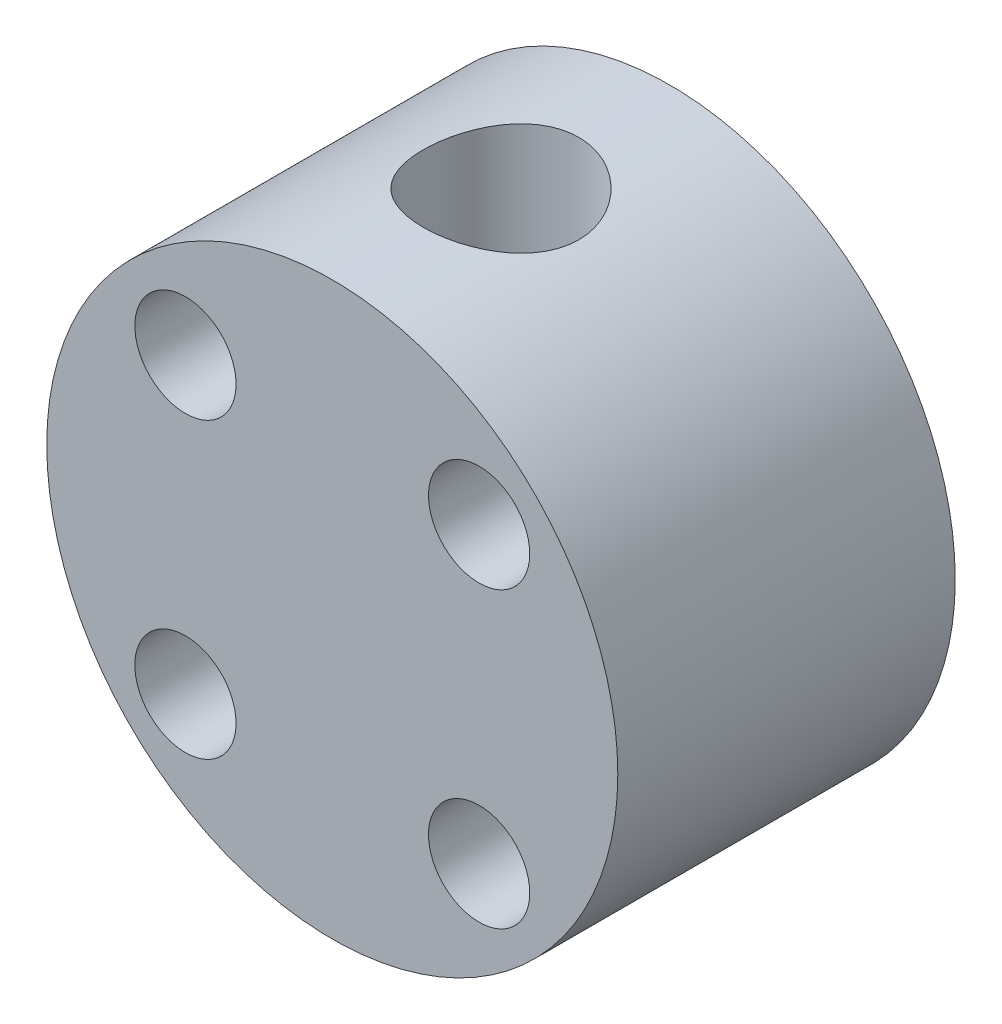
ISO-10303-21;
HEADER;
FILE_DESCRIPTION(('STEP AP214'),'2;1');
FILE_NAME('part.step','',(''),(''),'','','');
FILE_SCHEMA(('AUTOMOTIVE_DESIGN { 1 0 10303 214 1 1 1 1 }'));
ENDSEC;
DATA;
#1=APPLICATION_CONTEXT('core data for automotive mechanical design processes');
#2=APPLICATION_PROTOCOL_DEFINITION('international standard','automotive_design',2000,#1);
#3=PRODUCT_CONTEXT('',#1,'mechanical');
#4=PRODUCT('Part','Part','',(#3));
#5=PRODUCT_RELATED_PRODUCT_CATEGORY('part','',(#4));
#6=PRODUCT_DEFINITION_FORMATION('','',#4);
#7=PRODUCT_DEFINITION_CONTEXT('part definition',#1,'design');
#8=PRODUCT_DEFINITION('design','',#6,#7);
#9=PRODUCT_DEFINITION_SHAPE('','',#8);
#10=(LENGTH_UNIT() NAMED_UNIT(*) SI_UNIT(.MILLI.,.METRE.));
#11=(NAMED_UNIT(*) PLANE_ANGLE_UNIT() SI_UNIT($,.RADIAN.));
#12=(NAMED_UNIT(*) SI_UNIT($,.STERADIAN.) SOLID_ANGLE_UNIT());
#13=UNCERTAINTY_MEASURE_WITH_UNIT(LENGTH_MEASURE(1.E-05),#10,'distance_accuracy_value','');
#14=(GEOMETRIC_REPRESENTATION_CONTEXT(3) GLOBAL_UNCERTAINTY_ASSIGNED_CONTEXT((#13)) GLOBAL_UNIT_ASSIGNED_CONTEXT((#10,
#11,#12)) REPRESENTATION_CONTEXT('',''));
#15=CARTESIAN_POINT('',(0.,0.,0.));
#16=DIRECTION('',(0.,0.,1.));
#17=DIRECTION('',(1.,0.,0.));
#18=AXIS2_PLACEMENT_3D('',#15,#16,#17);
#19=CARTESIAN_POINT('',(0.,0.,6.5));
#20=DIRECTION('',(0.,0.,-1.));
#21=DIRECTION('',(-1.,0.,0.));
#22=AXIS2_PLACEMENT_3D('',#19,#20,#21);
#23=CYLINDRICAL_SURFACE('',#22,11.);
#24=CARTESIAN_POINT('',(0.,-11.,3.));
#25=CARTESIAN_POINT('',(0.165241826664387,-10.9999976543482,2.99999637477795));
#26=CARTESIAN_POINT('',(0.330521957625416,-10.9962401452152,2.98630187283317));
#27=CARTESIAN_POINT('',(0.656311860315395,-10.981615961709,2.93198833939364));
#28=CARTESIAN_POINT('',(0.81681945595453,-10.97074609481,2.89135721674281));
#29=CARTESIAN_POINT('',(1.12831525211079,-10.9430954434827,2.78459653652315));
#30=CARTESIAN_POINT('',(1.27931573394033,-10.9263224773879,2.71850069467617));
#31=CARTESIAN_POINT('',(1.56808899231944,-10.888633088257,2.56281413467515));
#32=CARTESIAN_POINT('',(1.70586072657955,-10.8677163391303,2.47322156729215));
#33=CARTESIAN_POINT('',(1.96759389514652,-10.8234279408412,2.27080032706548));
#34=CARTESIAN_POINT('',(2.09119025833987,-10.8000128298086,2.15750911829159));
#35=CARTESIAN_POINT('',(2.31788587364956,-10.7536422587013,1.91189472794019));
#36=CARTESIAN_POINT('',(2.42098235649443,-10.7306868611041,1.77956897919537));
#37=CARTESIAN_POINT('',(2.60555589078995,-10.6873876832732,1.49669750484106));
#38=CARTESIAN_POINT('',(2.68660853675173,-10.6670986011725,1.34586571012744));
#39=CARTESIAN_POINT('',(2.82205832722455,-10.6320701482383,1.03207234360125));
#40=CARTESIAN_POINT('',(2.87646063893688,-10.6173297017151,0.86911313022302));
#41=CARTESIAN_POINT('',(2.95578912882536,-10.5955169438548,0.539744209975064));
#42=CARTESIAN_POINT('',(2.98137921086458,-10.5882722456757,0.373506103676164));
#43=CARTESIAN_POINT('',(3.00442728818267,-10.5817565816817,0.0389506339823835));
#44=CARTESIAN_POINT('',(3.00189080281765,-10.5824840514652,-0.129366315000041));
#45=CARTESIAN_POINT('',(2.96928383560602,-10.5916764975091,-0.458083101932537));
#46=CARTESIAN_POINT('',(2.94002147337864,-10.5999143662734,-0.618570469204468));
#47=CARTESIAN_POINT('',(2.85608967743614,-10.6228351158812,-0.932266572045616));
#48=CARTESIAN_POINT('',(2.80141813009295,-10.6375185328831,-1.08547470093259));
#49=CARTESIAN_POINT('',(2.66757259652941,-10.6718723658465,-1.38234704109491));
#50=CARTESIAN_POINT('',(2.58811903765895,-10.6915991952828,-1.52587840206724));
#51=CARTESIAN_POINT('',(2.40715976044348,-10.7337873759558,-1.79785289481933));
#52=CARTESIAN_POINT('',(2.30564952212418,-10.756249287265,-1.92629292567749));
#53=CARTESIAN_POINT('',(2.07934693365792,-10.8023178998121,-2.16905037961287));
#54=CARTESIAN_POINT('',(1.9538772923345,-10.8259374859423,-2.28273489857788));
#55=CARTESIAN_POINT('',(1.68536402357727,-10.8709729541596,-2.48758192995557));
#56=CARTESIAN_POINT('',(1.54231963943711,-10.8923887412858,-2.57874347209924));
#57=CARTESIAN_POINT('',(1.24170790747925,-10.9307455624252,-2.73625334554985));
#58=CARTESIAN_POINT('',(1.08407527483555,-10.9476650257461,-2.80248267716789));
#59=CARTESIAN_POINT('',(0.75934537742878,-10.9749671228522,-2.90731594502829));
#60=CARTESIAN_POINT('',(0.592250288635364,-10.9853512528913,-2.94592620488828));
#61=CARTESIAN_POINT('',(0.258736340966502,-10.9981845755262,-2.99342123559394));
#62=CARTESIAN_POINT('',(0.0924485955679613,-11.0008632625074,-3.00316599064073));
#63=CARTESIAN_POINT('',(-0.239386731275946,-10.9986460317028,-2.99503450497314));
#64=CARTESIAN_POINT('',(-0.404934391065018,-10.9937509356601,-2.97716126076701));
#65=CARTESIAN_POINT('',(-0.727490195479109,-10.977084785319,-2.91500499459373));
#66=CARTESIAN_POINT('',(-0.88459864854534,-10.965439729442,-2.87120561448602));
#67=CARTESIAN_POINT('',(-1.18921973489728,-10.9365984707135,-2.75900551071898));
#68=CARTESIAN_POINT('',(-1.33673130261004,-10.9194016526918,-2.69060206067729));
#69=CARTESIAN_POINT('',(-1.62128232238913,-10.8808314765631,-2.52956711542878));
#70=CARTESIAN_POINT('',(-1.75804920482497,-10.8593805909887,-2.43647302547745));
#71=CARTESIAN_POINT('',(-2.01432044026183,-10.8147797682096,-2.22927742490896));
#72=CARTESIAN_POINT('',(-2.133821212356,-10.7916294800542,-2.11517156768291));
#73=CARTESIAN_POINT('',(-2.35582120688549,-10.7453880311357,-1.86517192393236));
#74=CARTESIAN_POINT('',(-2.45771255494154,-10.7223188995483,-1.72873323545015));
#75=CARTESIAN_POINT('',(-2.63717164416209,-10.6796005238857,-1.44020270555345));
#76=CARTESIAN_POINT('',(-2.71474035852927,-10.6599511429925,-1.28811149075488));
#77=CARTESIAN_POINT('',(-2.84277116633766,-10.6265249735947,-0.973318743535631));
#78=CARTESIAN_POINT('',(-2.8933870461064,-10.6127149622546,-0.810683479039428));
#79=CARTESIAN_POINT('',(-2.9664183443807,-10.5925362923412,-0.478766324044368));
#80=CARTESIAN_POINT('',(-2.98884137725659,-10.586165624571,-0.309486240931426));
#81=CARTESIAN_POINT('',(-3.00439791154423,-10.5817601934995,0.0246768076705755));
#82=CARTESIAN_POINT('',(-2.99851066433394,-10.5834467188085,0.18951117749585));
#83=CARTESIAN_POINT('',(-2.95989675286934,-10.5943100332908,0.515741295505627));
#84=CARTESIAN_POINT('',(-2.92717084057027,-10.6034866126106,0.677137139899413));
#85=CARTESIAN_POINT('',(-2.83638816870609,-10.6281263302192,0.990612631537776));
#86=CARTESIAN_POINT('',(-2.77854790898354,-10.6435356626191,1.14275950647964));
#87=CARTESIAN_POINT('',(-2.63934609082672,-10.6789037996565,1.43530655363056));
#88=CARTESIAN_POINT('',(-2.55798069008885,-10.6988633473566,1.5757048021314));
#89=CARTESIAN_POINT('',(-2.37110861969731,-10.7418475876651,1.84542119538421));
#90=CARTESIAN_POINT('',(-2.26493803644257,-10.7649475169129,1.97426740968593));
#91=CARTESIAN_POINT('',(-2.0327202239854,-10.8111998098094,2.2126328135895));
#92=CARTESIAN_POINT('',(-1.90666811877597,-10.834352184944,2.32214724801075));
#93=CARTESIAN_POINT('',(-1.63481545137218,-10.8787291835493,2.52118922903873));
#94=CARTESIAN_POINT('',(-1.48863173252504,-10.8998981550767,2.61020696173393));
#95=CARTESIAN_POINT('',(-1.18279979967855,-10.9373052756075,2.76226487242297));
#96=CARTESIAN_POINT('',(-1.02315990484244,-10.9535464430238,2.82532096110866));
#97=CARTESIAN_POINT('',(-0.720200202436422,-10.9772838799153,2.91587901995799));
#98=CARTESIAN_POINT('',(-0.578129280524935,-10.9857389536219,2.9473491024834));
#99=CARTESIAN_POINT('',(-0.290715215882967,-10.9970977432871,2.98941005063766));
#100=CARTESIAN_POINT('',(-0.145372431129893,-11.0000020636004,3.0000031893096));
#101=CARTESIAN_POINT('',(0.,-11.,3.));
#102=B_SPLINE_CURVE_WITH_KNOTS('',3,(#24,#25,#26,#27,#28,#29,#30,#31,#32,#33,#34,#35,#36,#37,
#38,#39,#40,#41,#42,#43,#44,#45,#46,#47,#48,#49,#50,#51,#52,#53,#54,#55,#56,#57,#58,#59,#60,#61,
#62,#63,#64,#65,#66,#67,#68,#69,#70,#71,#72,#73,#74,#75,#76,#77,#78,#79,#80,#81,#82,#83,#84,#85,
#86,#87,#88,#89,#90,#91,#92,#93,#94,#95,#96,#97,#98,#99,#100,#101),.UNSPECIFIED.,.T.,.F.,(4,2,2,
2,2,2,2,2,2,2,2,2,2,2,2,2,2,2,2,2,2,2,2,2,2,2,2,2,2,2,2,2,2,2,2,2,2,2,4),(0.,0.495192213709794,
0.9906068571026,1.48536780484116,1.98016770272941,2.48571756446357,2.99133567318647,
3.50609187300439,4.02074822781993,4.52328609721851,5.02572535393076,5.51345773349774,
6.00123069167434,6.49471853535856,6.98830760278243,7.4987705710155,8.00925552568848,
8.52214699472057,9.03492099533888,9.53225622686165,10.029537502105,10.5178222240039,
11.0061610695167,11.5043893801936,12.0027208731201,12.5158014612974,13.0288615173582,
13.5389619291417,14.0489245425547,14.5413770446734,15.0338157499215,15.5220911132461,
16.0104462704815,16.5137802279716,17.0172378222293,17.5321174459109,18.0466810522785,
18.4823766419936,18.9180247913559),.UNSPECIFIED.);
#103=CARTESIAN_POINT('',(0.,-11.,3.));
#104=VERTEX_POINT('',#103);
#105=EDGE_CURVE('E10',#104,#104,#102,.T.);
#106=ORIENTED_EDGE('',*,*,#105,.T.);
#107=EDGE_LOOP('',(#106));
#108=FACE_BOUND('',#107,.T.);
#109=CARTESIAN_POINT('',(0.,11.,3.));
#110=CARTESIAN_POINT('',(-0.165241826664387,10.9999976543482,2.99999637477794));
#111=CARTESIAN_POINT('',(-0.330521957625416,10.9962401452152,2.98630187283317));
#112=CARTESIAN_POINT('',(-0.656311860315395,10.981615961709,2.93198833939364));
#113=CARTESIAN_POINT('',(-0.81681945595453,10.97074609481,2.89135721674281));
#114=CARTESIAN_POINT('',(-1.12831525211079,10.9430954434827,2.78459653652315));
#115=CARTESIAN_POINT('',(-1.27931573394033,10.9263224773879,2.71850069467617));
#116=CARTESIAN_POINT('',(-1.56808899231944,10.888633088257,2.56281413467515));
#117=CARTESIAN_POINT('',(-1.70586072657955,10.8677163391303,2.47322156729215));
#118=CARTESIAN_POINT('',(-1.96759389514652,10.8234279408412,2.27080032706548));
#119=CARTESIAN_POINT('',(-2.09119025833987,10.8000128298086,2.15750911829159));
#120=CARTESIAN_POINT('',(-2.31788587364956,10.7536422587013,1.9118947279402));
#121=CARTESIAN_POINT('',(-2.42098235649443,10.7306868611041,1.77956897919537));
#122=CARTESIAN_POINT('',(-2.60555589078995,10.6873876832732,1.49669750484106));
#123=CARTESIAN_POINT('',(-2.68660853675173,10.6670986011725,1.34586571012744));
#124=CARTESIAN_POINT('',(-2.82205832722455,10.6320701482383,1.03207234360125));
#125=CARTESIAN_POINT('',(-2.87646063893688,10.6173297017151,0.869113130223021));
#126=CARTESIAN_POINT('',(-2.95578912882536,10.5955169438548,0.539744209975065));
#127=CARTESIAN_POINT('',(-2.98137921086458,10.5882722456757,0.373506103676164));
#128=CARTESIAN_POINT('',(-3.00442728818267,10.5817565816817,0.0389506339823838));
#129=CARTESIAN_POINT('',(-3.00189080281765,10.5824840514652,-0.129366315000041));
#130=CARTESIAN_POINT('',(-2.96928383560602,10.5916764975091,-0.458083101932537));
#131=CARTESIAN_POINT('',(-2.94002147337864,10.5999143662734,-0.618570469204468));
#132=CARTESIAN_POINT('',(-2.85608967743614,10.6228351158812,-0.932266572045615));
#133=CARTESIAN_POINT('',(-2.80141813009295,10.6375185328831,-1.08547470093259));
#134=CARTESIAN_POINT('',(-2.66757259652941,10.6718723658465,-1.38234704109491));
#135=CARTESIAN_POINT('',(-2.58811903765895,10.6915991952828,-1.52587840206724));
#136=CARTESIAN_POINT('',(-2.40715976044348,10.7337873759558,-1.79785289481933));
#137=CARTESIAN_POINT('',(-2.30564952212418,10.756249287265,-1.92629292567748));
#138=CARTESIAN_POINT('',(-2.07934693365792,10.8023178998121,-2.16905037961287));
#139=CARTESIAN_POINT('',(-1.9538772923345,10.8259374859423,-2.28273489857788));
#140=CARTESIAN_POINT('',(-1.68536402357727,10.8709729541596,-2.48758192995557));
#141=CARTESIAN_POINT('',(-1.54231963943711,10.8923887412858,-2.57874347209924));
#142=CARTESIAN_POINT('',(-1.24170790747925,10.9307455624252,-2.73625334554985));
#143=CARTESIAN_POINT('',(-1.08407527483555,10.9476650257461,-2.80248267716789));
#144=CARTESIAN_POINT('',(-0.75934537742878,10.9749671228522,-2.90731594502829));
#145=CARTESIAN_POINT('',(-0.592250288635364,10.9853512528913,-2.94592620488828));
#146=CARTESIAN_POINT('',(-0.258736340966502,10.9981845755262,-2.99342123559394));
#147=CARTESIAN_POINT('',(-0.0924485955679613,11.0008632625074,-3.00316599064073));
#148=CARTESIAN_POINT('',(0.239386731275946,10.9986460317028,-2.99503450497314));
#149=CARTESIAN_POINT('',(0.404934391065018,10.9937509356601,-2.97716126076701));
#150=CARTESIAN_POINT('',(0.727490195479109,10.977084785319,-2.91500499459373));
#151=CARTESIAN_POINT('',(0.88459864854534,10.965439729442,-2.87120561448602));
#152=CARTESIAN_POINT('',(1.18921973489728,10.9365984707135,-2.75900551071898));
#153=CARTESIAN_POINT('',(1.33673130261004,10.9194016526918,-2.69060206067729));
#154=CARTESIAN_POINT('',(1.62128232238913,10.8808314765631,-2.52956711542878));
#155=CARTESIAN_POINT('',(1.75804920482497,10.8593805909887,-2.43647302547745));
#156=CARTESIAN_POINT('',(2.01432044026183,10.8147797682096,-2.22927742490896));
#157=CARTESIAN_POINT('',(2.133821212356,10.7916294800542,-2.11517156768291));
#158=CARTESIAN_POINT('',(2.35582120688549,10.7453880311357,-1.86517192393236));
#159=CARTESIAN_POINT('',(2.45771255494154,10.7223188995483,-1.72873323545015));
#160=CARTESIAN_POINT('',(2.63717164416209,10.6796005238857,-1.44020270555345));
#161=CARTESIAN_POINT('',(2.71474035852927,10.6599511429925,-1.28811149075488));
#162=CARTESIAN_POINT('',(2.84277116633766,10.6265249735947,-0.973318743535631));
#163=CARTESIAN_POINT('',(2.8933870461064,10.6127149622546,-0.810683479039428));
#164=CARTESIAN_POINT('',(2.9664183443807,10.5925362923412,-0.478766324044368));
#165=CARTESIAN_POINT('',(2.98884137725659,10.586165624571,-0.309486240931426));
#166=CARTESIAN_POINT('',(3.00439791154423,10.5817601934995,0.0246768076705755));
#167=CARTESIAN_POINT('',(2.99851066433394,10.5834467188085,0.18951117749585));
#168=CARTESIAN_POINT('',(2.95989675286934,10.5943100332908,0.515741295505627));
#169=CARTESIAN_POINT('',(2.92717084057027,10.6034866126106,0.677137139899413));
#170=CARTESIAN_POINT('',(2.83638816870609,10.6281263302192,0.990612631537776));
#171=CARTESIAN_POINT('',(2.77854790898354,10.6435356626191,1.14275950647964));
#172=CARTESIAN_POINT('',(2.63934609082672,10.6789037996565,1.43530655363056));
#173=CARTESIAN_POINT('',(2.55798069008885,10.6988633473566,1.5757048021314));
#174=CARTESIAN_POINT('',(2.37110861969731,10.7418475876651,1.84542119538421));
#175=CARTESIAN_POINT('',(2.26493803644257,10.7649475169129,1.97426740968593));
#176=CARTESIAN_POINT('',(2.0327202239854,10.8111998098094,2.2126328135895));
#177=CARTESIAN_POINT('',(1.90666811877597,10.834352184944,2.32214724801075));
#178=CARTESIAN_POINT('',(1.63481545137218,10.8787291835493,2.52118922903873));
#179=CARTESIAN_POINT('',(1.48863173252504,10.8998981550767,2.61020696173393));
#180=CARTESIAN_POINT('',(1.18279979967855,10.9373052756075,2.76226487242297));
#181=CARTESIAN_POINT('',(1.02315990484244,10.9535464430238,2.82532096110866));
#182=CARTESIAN_POINT('',(0.720200202436422,10.9772838799153,2.91587901995799));
#183=CARTESIAN_POINT('',(0.578129280524935,10.9857389536219,2.9473491024834));
#184=CARTESIAN_POINT('',(0.290715215882967,10.9970977432871,2.98941005063766));
#185=CARTESIAN_POINT('',(0.145372431129893,11.0000020636004,3.0000031893096));
#186=CARTESIAN_POINT('',(0.,11.,3.));
#187=B_SPLINE_CURVE_WITH_KNOTS('',3,(#109,#110,#111,#112,#113,#114,#115,#116,#117,#118,#119,
#120,#121,#122,#123,#124,#125,#126,#127,#128,#129,#130,#131,#132,#133,#134,#135,#136,#137,#138,
#139,#140,#141,#142,#143,#144,#145,#146,#147,#148,#149,#150,#151,#152,#153,#154,#155,#156,#157,
#158,#159,#160,#161,#162,#163,#164,#165,#166,#167,#168,#169,#170,#171,#172,#173,#174,#175,#176,
#177,#178,#179,#180,#181,#182,#183,#184,#185,#186),.UNSPECIFIED.,.T.,.F.,(4,2,2,2,2,2,2,2,2,2,2,
2,2,2,2,2,2,2,2,2,2,2,2,2,2,2,2,2,2,2,2,2,2,2,2,2,2,2,4),(0.,0.495192213709794,0.9906068571026,
1.48536780484116,1.98016770272941,2.48571756446357,2.99133567318647,3.50609187300439,
4.02074822781993,4.52328609721851,5.02572535393075,5.51345773349774,6.00123069167434,
6.49471853535856,6.98830760278242,7.4987705710155,8.00925552568848,8.52214699472057,
9.03492099533888,9.53225622686165,10.029537502105,10.5178222240039,11.0061610695167,
11.5043893801936,12.0027208731201,12.5158014612974,13.0288615173582,13.5389619291417,
14.0489245425547,14.5413770446734,15.0338157499215,15.5220911132461,16.0104462704815,
16.5137802279716,17.0172378222293,17.5321174459109,18.0466810522785,18.4823766419936,
18.9180247913559),.UNSPECIFIED.);
#188=CARTESIAN_POINT('',(0.,11.,3.));
#189=VERTEX_POINT('',#188);
#190=EDGE_CURVE('E49',#189,#189,#187,.T.);
#191=ORIENTED_EDGE('',*,*,#190,.T.);
#192=EDGE_LOOP('',(#191));
#193=FACE_BOUND('',#192,.T.);
#194=CARTESIAN_POINT('',(0.,0.,6.5));
#195=DIRECTION('',(0.,0.,1.));
#196=DIRECTION('',(1.,0.,0.));
#197=AXIS2_PLACEMENT_3D('',#194,#195,#196);
#198=CIRCLE('',#197,11.);
#199=CARTESIAN_POINT('',(11.,0.,6.5));
#200=VERTEX_POINT('',#199);
#201=EDGE_CURVE('E54',#200,#200,#198,.T.);
#202=ORIENTED_EDGE('',*,*,#201,.F.);
#203=EDGE_LOOP('',(#202));
#204=FACE_BOUND('',#203,.T.);
#205=CARTESIAN_POINT('',(0.,0.,-6.5));
#206=DIRECTION('',(0.,0.,1.));
#207=DIRECTION('',(1.,0.,0.));
#208=AXIS2_PLACEMENT_3D('',#205,#206,#207);
#209=CIRCLE('',#208,11.);
#210=CARTESIAN_POINT('',(11.,0.,-6.5));
#211=VERTEX_POINT('',#210);
#212=EDGE_CURVE('E59',#211,#211,#209,.T.);
#213=ORIENTED_EDGE('',*,*,#212,.T.);
#214=EDGE_LOOP('',(#213));
#215=FACE_BOUND('',#214,.T.);
#216=ADVANCED_FACE('F37',(#108,#193,#204,#215),#23,.T.);
#217=CARTESIAN_POINT('',(0.,0.,6.5));
#218=DIRECTION('',(0.,0.,1.));
#219=DIRECTION('',(1.,0.,0.));
#220=AXIS2_PLACEMENT_3D('',#217,#218,#219);
#221=PLANE('',#220);
#222=CARTESIAN_POINT('',(5.65685424949238,5.65685424949238,6.5));
#223=DIRECTION('',(0.,0.,1.));
#224=DIRECTION('',(1.,0.,0.));
#225=AXIS2_PLACEMENT_3D('',#222,#223,#224);
#226=CIRCLE('',#225,1.95);
#227=CARTESIAN_POINT('',(7.60685424949238,5.65685424949238,6.5));
#228=VERTEX_POINT('',#227);
#229=EDGE_CURVE('E124',#228,#228,#226,.T.);
#230=ORIENTED_EDGE('',*,*,#229,.F.);
#231=EDGE_LOOP('',(#230));
#232=FACE_BOUND('',#231,.T.);
#233=CARTESIAN_POINT('',(-5.65685424949238,-5.65685424949238,6.5));
#234=DIRECTION('',(0.,0.,1.));
#235=DIRECTION('',(1.,0.,0.));
#236=AXIS2_PLACEMENT_3D('',#233,#234,#235);
#237=CIRCLE('',#236,1.95);
#238=CARTESIAN_POINT('',(-3.70685424949238,-5.65685424949238,6.5));
#239=VERTEX_POINT('',#238);
#240=EDGE_CURVE('E117',#239,#239,#237,.T.);
#241=ORIENTED_EDGE('',*,*,#240,.F.);
#242=EDGE_LOOP('',(#241));
#243=FACE_BOUND('',#242,.T.);
#244=CARTESIAN_POINT('',(-5.65685424949238,5.65685424949238,6.5));
#245=DIRECTION('',(0.,0.,1.));
#246=DIRECTION('',(1.,0.,0.));
#247=AXIS2_PLACEMENT_3D('',#244,#245,#246);
#248=CIRCLE('',#247,1.95);
#249=CARTESIAN_POINT('',(-3.70685424949238,5.65685424949238,6.5));
#250=VERTEX_POINT('',#249);
#251=EDGE_CURVE('E109',#250,#250,#248,.T.);
#252=ORIENTED_EDGE('',*,*,#251,.F.);
#253=EDGE_LOOP('',(#252));
#254=FACE_BOUND('',#253,.T.);
#255=CARTESIAN_POINT('',(5.65685424949238,-5.65685424949238,6.5));
#256=DIRECTION('',(0.,0.,1.));
#257=DIRECTION('',(1.,0.,0.));
#258=AXIS2_PLACEMENT_3D('',#255,#256,#257);
#259=CIRCLE('',#258,1.95);
#260=CARTESIAN_POINT('',(7.60685424949238,-5.65685424949238,6.5));
#261=VERTEX_POINT('',#260);
#262=EDGE_CURVE('E97',#261,#261,#259,.T.);
#263=ORIENTED_EDGE('',*,*,#262,.F.);
#264=EDGE_LOOP('',(#263));
#265=FACE_BOUND('',#264,.T.);
#266=ORIENTED_EDGE('',*,*,#201,.T.);
#267=EDGE_LOOP('',(#266));
#268=FACE_BOUND('',#267,.T.);
#269=ADVANCED_FACE('F74',(#232,#243,#254,#265,#268),#221,.T.);
#270=CARTESIAN_POINT('',(0.,0.,-6.5));
#271=DIRECTION('',(0.,0.,1.));
#272=DIRECTION('',(1.,0.,0.));
#273=AXIS2_PLACEMENT_3D('',#270,#271,#272);
#274=PLANE('',#273);
#275=CARTESIAN_POINT('',(5.65685424949238,5.65685424949238,-6.5));
#276=DIRECTION('',(0.,0.,1.));
#277=DIRECTION('',(1.,0.,0.));
#278=AXIS2_PLACEMENT_3D('',#275,#276,#277);
#279=CIRCLE('',#278,1.95);
#280=CARTESIAN_POINT('',(7.60685424949238,5.65685424949238,-6.5));
#281=VERTEX_POINT('',#280);
#282=EDGE_CURVE('E121',#281,#281,#279,.T.);
#283=ORIENTED_EDGE('',*,*,#282,.T.);
#284=EDGE_LOOP('',(#283));
#285=FACE_BOUND('',#284,.T.);
#286=CARTESIAN_POINT('',(-5.65685424949238,-5.65685424949238,-6.5));
#287=DIRECTION('',(0.,0.,1.));
#288=DIRECTION('',(1.,0.,0.));
#289=AXIS2_PLACEMENT_3D('',#286,#287,#288);
#290=CIRCLE('',#289,1.95);
#291=CARTESIAN_POINT('',(-3.70685424949238,-5.65685424949238,-6.5));
#292=VERTEX_POINT('',#291);
#293=EDGE_CURVE('E113',#292,#292,#290,.T.);
#294=ORIENTED_EDGE('',*,*,#293,.T.);
#295=EDGE_LOOP('',(#294));
#296=FACE_BOUND('',#295,.T.);
#297=CARTESIAN_POINT('',(-5.65685424949238,5.65685424949238,-6.5));
#298=DIRECTION('',(0.,0.,1.));
#299=DIRECTION('',(1.,0.,0.));
#300=AXIS2_PLACEMENT_3D('',#297,#298,#299);
#301=CIRCLE('',#300,1.95);
#302=CARTESIAN_POINT('',(-3.70685424949238,5.65685424949238,-6.5));
#303=VERTEX_POINT('',#302);
#304=EDGE_CURVE('E103',#303,#303,#301,.T.);
#305=ORIENTED_EDGE('',*,*,#304,.T.);
#306=EDGE_LOOP('',(#305));
#307=FACE_BOUND('',#306,.T.);
#308=CARTESIAN_POINT('',(5.65685424949238,-5.65685424949238,-6.5));
#309=DIRECTION('',(0.,0.,1.));
#310=DIRECTION('',(1.,0.,0.));
#311=AXIS2_PLACEMENT_3D('',#308,#309,#310);
#312=CIRCLE('',#311,1.95);
#313=CARTESIAN_POINT('',(7.60685424949238,-5.65685424949238,-6.5));
#314=VERTEX_POINT('',#313);
#315=EDGE_CURVE('E94',#314,#314,#312,.T.);
#316=ORIENTED_EDGE('',*,*,#315,.T.);
#317=EDGE_LOOP('',(#316));
#318=FACE_BOUND('',#317,.T.);
#319=ORIENTED_EDGE('',*,*,#212,.F.);
#320=EDGE_LOOP('',(#319));
#321=FACE_BOUND('',#320,.T.);
#322=ADVANCED_FACE('F71',(#285,#296,#307,#318,#321),#274,.F.);
#323=CARTESIAN_POINT('',(0.,-11.,0.));
#324=DIRECTION('',(0.,1.,0.));
#325=DIRECTION('',(0.,0.,1.));
#326=AXIS2_PLACEMENT_3D('',#323,#324,#325);
#327=CYLINDRICAL_SURFACE('',#326,3.);
#328=ORIENTED_EDGE('',*,*,#190,.F.);
#329=EDGE_LOOP('',(#328));
#330=FACE_BOUND('',#329,.T.);
#331=ORIENTED_EDGE('',*,*,#105,.F.);
#332=EDGE_LOOP('',(#331));
#333=FACE_BOUND('',#332,.T.);
#334=ADVANCED_FACE('F65',(#330,#333),#327,.F.);
#335=CARTESIAN_POINT('',(5.65685424949238,-5.65685424949238,6.5));
#336=DIRECTION('',(0.,0.,1.));
#337=DIRECTION('',(1.,0.,0.));
#338=AXIS2_PLACEMENT_3D('',#335,#336,#337);
#339=CYLINDRICAL_SURFACE('',#338,1.95);
#340=ORIENTED_EDGE('',*,*,#315,.F.);
#341=EDGE_LOOP('',(#340));
#342=FACE_BOUND('',#341,.T.);
#343=ORIENTED_EDGE('',*,*,#262,.T.);
#344=EDGE_LOOP('',(#343));
#345=FACE_BOUND('',#344,.T.);
#346=ADVANCED_FACE('F70',(#342,#345),#339,.F.);
#347=CARTESIAN_POINT('',(-5.65685424949238,5.65685424949238,6.5));
#348=DIRECTION('',(0.,0.,1.));
#349=DIRECTION('',(1.,0.,0.));
#350=AXIS2_PLACEMENT_3D('',#347,#348,#349);
#351=CYLINDRICAL_SURFACE('',#350,1.95);
#352=ORIENTED_EDGE('',*,*,#304,.F.);
#353=EDGE_LOOP('',(#352));
#354=FACE_BOUND('',#353,.T.);
#355=ORIENTED_EDGE('',*,*,#251,.T.);
#356=EDGE_LOOP('',(#355));
#357=FACE_BOUND('',#356,.T.);
#358=ADVANCED_FACE('F139',(#354,#357),#351,.F.);
#359=CARTESIAN_POINT('',(-5.65685424949238,-5.65685424949238,6.5));
#360=DIRECTION('',(0.,0.,1.));
#361=DIRECTION('',(1.,0.,0.));
#362=AXIS2_PLACEMENT_3D('',#359,#360,#361);
#363=CYLINDRICAL_SURFACE('',#362,1.95);
#364=ORIENTED_EDGE('',*,*,#293,.F.);
#365=EDGE_LOOP('',(#364));
#366=FACE_BOUND('',#365,.T.);
#367=ORIENTED_EDGE('',*,*,#240,.T.);
#368=EDGE_LOOP('',(#367));
#369=FACE_BOUND('',#368,.T.);
#370=ADVANCED_FACE('F144',(#366,#369),#363,.F.);
#371=CARTESIAN_POINT('',(5.65685424949238,5.65685424949238,6.5));
#372=DIRECTION('',(0.,0.,1.));
#373=DIRECTION('',(1.,0.,0.));
#374=AXIS2_PLACEMENT_3D('',#371,#372,#373);
#375=CYLINDRICAL_SURFACE('',#374,1.95);
#376=ORIENTED_EDGE('',*,*,#282,.F.);
#377=EDGE_LOOP('',(#376));
#378=FACE_BOUND('',#377,.T.);
#379=ORIENTED_EDGE('',*,*,#229,.T.);
#380=EDGE_LOOP('',(#379));
#381=FACE_BOUND('',#380,.T.);
#382=ADVANCED_FACE('F129',(#378,#381),#375,.F.);
#383=CLOSED_SHELL('',(#216,#269,#322,#334,#346,#358,#370,#382));
#384=MANIFOLD_SOLID_BREP('B2',#383);
#385=ADVANCED_BREP_SHAPE_REPRESENTATION('',(#18,#384),#14);
#386=SHAPE_DEFINITION_REPRESENTATION(#9,#385);
ENDSEC;
END-ISO-10303-21;
